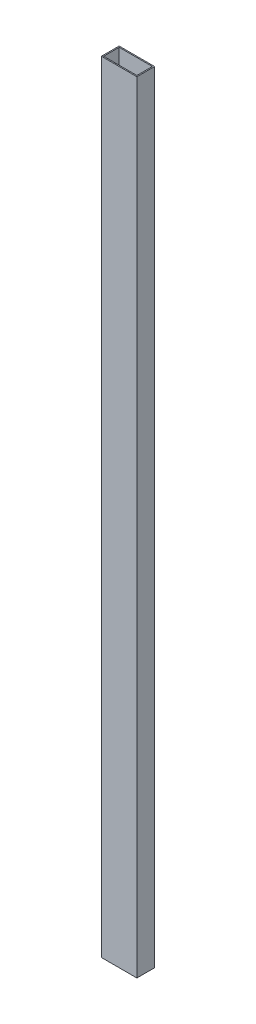
ISO-10303-21;
HEADER;
FILE_DESCRIPTION(('STEP AP214'),'2;1');
FILE_NAME('part.step','',(''),(''),'','','');
FILE_SCHEMA(('AUTOMOTIVE_DESIGN { 1 0 10303 214 1 1 1 1 }'));
ENDSEC;
DATA;
#1=APPLICATION_CONTEXT('core data for automotive mechanical design processes');
#2=APPLICATION_PROTOCOL_DEFINITION('international standard','automotive_design',2000,#1);
#3=PRODUCT_CONTEXT('',#1,'mechanical');
#4=PRODUCT('Part','Part','',(#3));
#5=PRODUCT_RELATED_PRODUCT_CATEGORY('part','',(#4));
#6=PRODUCT_DEFINITION_FORMATION('','',#4);
#7=PRODUCT_DEFINITION_CONTEXT('part definition',#1,'design');
#8=PRODUCT_DEFINITION('design','',#6,#7);
#9=PRODUCT_DEFINITION_SHAPE('','',#8);
#10=(LENGTH_UNIT() NAMED_UNIT(*) SI_UNIT(.MILLI.,.METRE.));
#11=(NAMED_UNIT(*) PLANE_ANGLE_UNIT() SI_UNIT($,.RADIAN.));
#12=(NAMED_UNIT(*) SI_UNIT($,.STERADIAN.) SOLID_ANGLE_UNIT());
#13=UNCERTAINTY_MEASURE_WITH_UNIT(LENGTH_MEASURE(1.E-05),#10,'distance_accuracy_value','');
#14=(GEOMETRIC_REPRESENTATION_CONTEXT(3) GLOBAL_UNCERTAINTY_ASSIGNED_CONTEXT((#13)) GLOBAL_UNIT_ASSIGNED_CONTEXT((#10,
#11,#12)) REPRESENTATION_CONTEXT('',''));
#15=CARTESIAN_POINT('',(0.,0.,0.));
#16=DIRECTION('',(0.,0.,1.));
#17=DIRECTION('',(1.,0.,0.));
#18=AXIS2_PLACEMENT_3D('',#15,#16,#17);
#19=CARTESIAN_POINT('',(0.,1117.6,0.));
#20=DIRECTION('',(0.,-1.,0.));
#21=DIRECTION('',(0.,0.,-1.));
#22=AXIS2_PLACEMENT_3D('',#19,#20,#21);
#23=PLANE('',#22);
#24=DIRECTION('',(0.,0.,1.));
#25=VECTOR('',#24,1.);
#26=CARTESIAN_POINT('',(-1.5875,1117.6,1.5875));
#27=LINE('',#26,#25);
#28=CARTESIAN_POINT('',(-1.5875,1117.6,-23.8125));
#29=VERTEX_POINT('',#28);
#30=CARTESIAN_POINT('',(-1.5875,1117.6,1.5875));
#31=VERTEX_POINT('',#30);
#32=EDGE_CURVE('E134',#29,#31,#27,.T.);
#33=ORIENTED_EDGE('',*,*,#32,.T.);
#34=DIRECTION('',(1.,0.,0.));
#35=VECTOR('',#34,1.);
#36=CARTESIAN_POINT('',(-1.5875,1117.6,1.5875));
#37=LINE('',#36,#35);
#38=CARTESIAN_POINT('',(49.2125,1117.6,1.5875));
#39=VERTEX_POINT('',#38);
#40=EDGE_CURVE('E137',#31,#39,#37,.T.);
#41=ORIENTED_EDGE('',*,*,#40,.T.);
#42=DIRECTION('',(0.,0.,-1.));
#43=VECTOR('',#42,1.);
#44=CARTESIAN_POINT('',(49.2125,1117.6,1.5875));
#45=LINE('',#44,#43);
#46=CARTESIAN_POINT('',(49.2125,1117.6,-23.8125));
#47=VERTEX_POINT('',#46);
#48=EDGE_CURVE('E140',#39,#47,#45,.T.);
#49=ORIENTED_EDGE('',*,*,#48,.T.);
#50=DIRECTION('',(-1.,0.,0.));
#51=VECTOR('',#50,1.);
#52=CARTESIAN_POINT('',(-1.5875,1117.6,-23.8125));
#53=LINE('',#52,#51);
#54=EDGE_CURVE('E142',#47,#29,#53,.T.);
#55=ORIENTED_EDGE('',*,*,#54,.T.);
#56=EDGE_LOOP('',(#33,#41,#49,#55));
#57=FACE_BOUND('',#56,.T.);
#58=DIRECTION('',(0.,0.,1.));
#59=VECTOR('',#58,1.);
#60=CARTESIAN_POINT('',(0.,1117.6,0.));
#61=LINE('',#60,#59);
#62=CARTESIAN_POINT('',(0.,1117.6,-22.225));
#63=VERTEX_POINT('',#62);
#64=CARTESIAN_POINT('',(0.,1117.6,0.));
#65=VERTEX_POINT('',#64);
#66=EDGE_CURVE('E98',#63,#65,#61,.T.);
#67=ORIENTED_EDGE('',*,*,#66,.F.);
#68=DIRECTION('',(-1.,0.,0.));
#69=VECTOR('',#68,1.);
#70=CARTESIAN_POINT('',(0.,1117.6,-22.225));
#71=LINE('',#70,#69);
#72=CARTESIAN_POINT('',(47.625,1117.6,-22.225));
#73=VERTEX_POINT('',#72);
#74=EDGE_CURVE('E120',#73,#63,#71,.T.);
#75=ORIENTED_EDGE('',*,*,#74,.F.);
#76=DIRECTION('',(0.,0.,-1.));
#77=VECTOR('',#76,1.);
#78=CARTESIAN_POINT('',(47.625,1117.6,0.));
#79=LINE('',#78,#77);
#80=CARTESIAN_POINT('',(47.625,1117.6,0.));
#81=VERTEX_POINT('',#80);
#82=EDGE_CURVE('E118',#81,#73,#79,.T.);
#83=ORIENTED_EDGE('',*,*,#82,.F.);
#84=DIRECTION('',(1.,0.,0.));
#85=VECTOR('',#84,1.);
#86=CARTESIAN_POINT('',(0.,1117.6,0.));
#87=LINE('',#86,#85);
#88=EDGE_CURVE('E106',#65,#81,#87,.T.);
#89=ORIENTED_EDGE('',*,*,#88,.F.);
#90=EDGE_LOOP('',(#67,#75,#83,#89));
#91=FACE_BOUND('',#90,.T.);
#92=ADVANCED_FACE('F33',(#57,#91),#23,.F.);
#93=CARTESIAN_POINT('',(0.,0.,0.));
#94=DIRECTION('',(0.,-1.,0.));
#95=DIRECTION('',(0.,0.,-1.));
#96=AXIS2_PLACEMENT_3D('',#93,#94,#95);
#97=PLANE('',#96);
#98=DIRECTION('',(0.,0.,1.));
#99=VECTOR('',#98,1.);
#100=CARTESIAN_POINT('',(-1.5875,0.,1.5875));
#101=LINE('',#100,#99);
#102=CARTESIAN_POINT('',(-1.5875,0.,-23.8125));
#103=VERTEX_POINT('',#102);
#104=CARTESIAN_POINT('',(-1.5875,0.,1.5875));
#105=VERTEX_POINT('',#104);
#106=EDGE_CURVE('E114',#103,#105,#101,.T.);
#107=ORIENTED_EDGE('',*,*,#106,.F.);
#108=DIRECTION('',(-1.,0.,0.));
#109=VECTOR('',#108,1.);
#110=CARTESIAN_POINT('',(-1.5875,0.,-23.8125));
#111=LINE('',#110,#109);
#112=CARTESIAN_POINT('',(49.2125,0.,-23.8125));
#113=VERTEX_POINT('',#112);
#114=EDGE_CURVE('E138',#113,#103,#111,.T.);
#115=ORIENTED_EDGE('',*,*,#114,.F.);
#116=DIRECTION('',(0.,0.,-1.));
#117=VECTOR('',#116,1.);
#118=CARTESIAN_POINT('',(49.2125,0.,1.5875));
#119=LINE('',#118,#117);
#120=CARTESIAN_POINT('',(49.2125,0.,1.5875));
#121=VERTEX_POINT('',#120);
#122=EDGE_CURVE('E149',#121,#113,#119,.T.);
#123=ORIENTED_EDGE('',*,*,#122,.F.);
#124=DIRECTION('',(1.,0.,0.));
#125=VECTOR('',#124,1.);
#126=CARTESIAN_POINT('',(-1.5875,0.,1.5875));
#127=LINE('',#126,#125);
#128=EDGE_CURVE('E147',#105,#121,#127,.T.);
#129=ORIENTED_EDGE('',*,*,#128,.F.);
#130=EDGE_LOOP('',(#107,#115,#123,#129));
#131=FACE_BOUND('',#130,.T.);
#132=DIRECTION('',(-1.,0.,0.));
#133=VECTOR('',#132,1.);
#134=CARTESIAN_POINT('',(0.,0.,-22.225));
#135=LINE('',#134,#133);
#136=CARTESIAN_POINT('',(47.625,0.,-22.225));
#137=VERTEX_POINT('',#136);
#138=CARTESIAN_POINT('',(0.,0.,-22.225));
#139=VERTEX_POINT('',#138);
#140=EDGE_CURVE('E107',#137,#139,#135,.T.);
#141=ORIENTED_EDGE('',*,*,#140,.T.);
#142=DIRECTION('',(0.,0.,1.));
#143=VECTOR('',#142,1.);
#144=CARTESIAN_POINT('',(0.,0.,0.));
#145=LINE('',#144,#143);
#146=CARTESIAN_POINT('',(0.,0.,0.));
#147=VERTEX_POINT('',#146);
#148=EDGE_CURVE('E56',#139,#147,#145,.T.);
#149=ORIENTED_EDGE('',*,*,#148,.T.);
#150=DIRECTION('',(1.,0.,0.));
#151=VECTOR('',#150,1.);
#152=CARTESIAN_POINT('',(0.,0.,0.));
#153=LINE('',#152,#151);
#154=CARTESIAN_POINT('',(47.625,0.,0.));
#155=VERTEX_POINT('',#154);
#156=EDGE_CURVE('E113',#147,#155,#153,.T.);
#157=ORIENTED_EDGE('',*,*,#156,.T.);
#158=DIRECTION('',(0.,0.,-1.));
#159=VECTOR('',#158,1.);
#160=CARTESIAN_POINT('',(47.625,0.,0.));
#161=LINE('',#160,#159);
#162=EDGE_CURVE('E126',#155,#137,#161,.T.);
#163=ORIENTED_EDGE('',*,*,#162,.T.);
#164=EDGE_LOOP('',(#141,#149,#157,#163));
#165=FACE_BOUND('',#164,.T.);
#166=ADVANCED_FACE('F167',(#131,#165),#97,.T.);
#167=CARTESIAN_POINT('',(-1.5875,1117.6,1.5875));
#168=DIRECTION('',(1.,0.,0.));
#169=DIRECTION('',(0.,0.,-1.));
#170=AXIS2_PLACEMENT_3D('',#167,#168,#169);
#171=PLANE('',#170);
#172=ORIENTED_EDGE('',*,*,#106,.T.);
#173=DIRECTION('',(0.,-1.,0.));
#174=VECTOR('',#173,1.);
#175=CARTESIAN_POINT('',(-1.5875,1117.6,1.5875));
#176=LINE('',#175,#174);
#177=EDGE_CURVE('E11',#31,#105,#176,.T.);
#178=ORIENTED_EDGE('',*,*,#177,.F.);
#179=ORIENTED_EDGE('',*,*,#32,.F.);
#180=DIRECTION('',(0.,-1.,0.));
#181=VECTOR('',#180,1.);
#182=CARTESIAN_POINT('',(-1.5875,1117.6,-23.8125));
#183=LINE('',#182,#181);
#184=EDGE_CURVE('E144',#29,#103,#183,.T.);
#185=ORIENTED_EDGE('',*,*,#184,.T.);
#186=EDGE_LOOP('',(#172,#178,#179,#185));
#187=FACE_BOUND('',#186,.T.);
#188=ADVANCED_FACE('F35',(#187),#171,.F.);
#189=CARTESIAN_POINT('',(-1.5875,1117.6,1.5875));
#190=DIRECTION('',(0.,0.,-1.));
#191=DIRECTION('',(-1.,0.,0.));
#192=AXIS2_PLACEMENT_3D('',#189,#190,#191);
#193=PLANE('',#192);
#194=ORIENTED_EDGE('',*,*,#128,.T.);
#195=DIRECTION('',(0.,-1.,0.));
#196=VECTOR('',#195,1.);
#197=CARTESIAN_POINT('',(49.2125,1117.6,1.5875));
#198=LINE('',#197,#196);
#199=EDGE_CURVE('E41',#39,#121,#198,.T.);
#200=ORIENTED_EDGE('',*,*,#199,.F.);
#201=ORIENTED_EDGE('',*,*,#40,.F.);
#202=ORIENTED_EDGE('',*,*,#177,.T.);
#203=EDGE_LOOP('',(#194,#200,#201,#202));
#204=FACE_BOUND('',#203,.T.);
#205=ADVANCED_FACE('F177',(#204),#193,.F.);
#206=CARTESIAN_POINT('',(49.2125,1117.6,1.5875));
#207=DIRECTION('',(-1.,0.,0.));
#208=DIRECTION('',(0.,0.,1.));
#209=AXIS2_PLACEMENT_3D('',#206,#207,#208);
#210=PLANE('',#209);
#211=ORIENTED_EDGE('',*,*,#122,.T.);
#212=DIRECTION('',(0.,-1.,0.));
#213=VECTOR('',#212,1.);
#214=CARTESIAN_POINT('',(49.2125,1117.6,-23.8125));
#215=LINE('',#214,#213);
#216=EDGE_CURVE('E154',#47,#113,#215,.T.);
#217=ORIENTED_EDGE('',*,*,#216,.F.);
#218=ORIENTED_EDGE('',*,*,#48,.F.);
#219=ORIENTED_EDGE('',*,*,#199,.T.);
#220=EDGE_LOOP('',(#211,#217,#218,#219));
#221=FACE_BOUND('',#220,.T.);
#222=ADVANCED_FACE('F161',(#221),#210,.F.);
#223=CARTESIAN_POINT('',(-1.5875,1117.6,-23.8125));
#224=DIRECTION('',(0.,0.,1.));
#225=DIRECTION('',(1.,0.,0.));
#226=AXIS2_PLACEMENT_3D('',#223,#224,#225);
#227=PLANE('',#226);
#228=ORIENTED_EDGE('',*,*,#114,.T.);
#229=ORIENTED_EDGE('',*,*,#184,.F.);
#230=ORIENTED_EDGE('',*,*,#54,.F.);
#231=ORIENTED_EDGE('',*,*,#216,.T.);
#232=EDGE_LOOP('',(#228,#229,#230,#231));
#233=FACE_BOUND('',#232,.T.);
#234=ADVANCED_FACE('F171',(#233),#227,.F.);
#235=CARTESIAN_POINT('',(0.,1117.6,0.));
#236=DIRECTION('',(1.,0.,0.));
#237=DIRECTION('',(0.,0.,-1.));
#238=AXIS2_PLACEMENT_3D('',#235,#236,#237);
#239=PLANE('',#238);
#240=ORIENTED_EDGE('',*,*,#148,.F.);
#241=DIRECTION('',(0.,-1.,0.));
#242=VECTOR('',#241,1.);
#243=CARTESIAN_POINT('',(0.,1117.6,-22.225));
#244=LINE('',#243,#242);
#245=EDGE_CURVE('E102',#63,#139,#244,.T.);
#246=ORIENTED_EDGE('',*,*,#245,.F.);
#247=ORIENTED_EDGE('',*,*,#66,.T.);
#248=DIRECTION('',(0.,-1.,0.));
#249=VECTOR('',#248,1.);
#250=CARTESIAN_POINT('',(0.,1117.6,0.));
#251=LINE('',#250,#249);
#252=EDGE_CURVE('E101',#65,#147,#251,.T.);
#253=ORIENTED_EDGE('',*,*,#252,.T.);
#254=EDGE_LOOP('',(#240,#246,#247,#253));
#255=FACE_BOUND('',#254,.T.);
#256=ADVANCED_FACE('F100',(#255),#239,.T.);
#257=CARTESIAN_POINT('',(0.,1117.6,0.));
#258=DIRECTION('',(0.,0.,-1.));
#259=DIRECTION('',(-1.,0.,0.));
#260=AXIS2_PLACEMENT_3D('',#257,#258,#259);
#261=PLANE('',#260);
#262=ORIENTED_EDGE('',*,*,#156,.F.);
#263=ORIENTED_EDGE('',*,*,#252,.F.);
#264=ORIENTED_EDGE('',*,*,#88,.T.);
#265=DIRECTION('',(0.,-1.,0.));
#266=VECTOR('',#265,1.);
#267=CARTESIAN_POINT('',(47.625,1117.6,0.));
#268=LINE('',#267,#266);
#269=EDGE_CURVE('E115',#81,#155,#268,.T.);
#270=ORIENTED_EDGE('',*,*,#269,.T.);
#271=EDGE_LOOP('',(#262,#263,#264,#270));
#272=FACE_BOUND('',#271,.T.);
#273=ADVANCED_FACE('F110',(#272),#261,.T.);
#274=CARTESIAN_POINT('',(47.625,1117.6,0.));
#275=DIRECTION('',(-1.,0.,0.));
#276=DIRECTION('',(0.,0.,1.));
#277=AXIS2_PLACEMENT_3D('',#274,#275,#276);
#278=PLANE('',#277);
#279=ORIENTED_EDGE('',*,*,#162,.F.);
#280=ORIENTED_EDGE('',*,*,#269,.F.);
#281=ORIENTED_EDGE('',*,*,#82,.T.);
#282=DIRECTION('',(0.,-1.,0.));
#283=VECTOR('',#282,1.);
#284=CARTESIAN_POINT('',(47.625,1117.6,-22.225));
#285=LINE('',#284,#283);
#286=EDGE_CURVE('E48',#73,#137,#285,.T.);
#287=ORIENTED_EDGE('',*,*,#286,.T.);
#288=EDGE_LOOP('',(#279,#280,#281,#287));
#289=FACE_BOUND('',#288,.T.);
#290=ADVANCED_FACE('F200',(#289),#278,.T.);
#291=CARTESIAN_POINT('',(0.,1117.6,-22.225));
#292=DIRECTION('',(0.,0.,1.));
#293=DIRECTION('',(1.,0.,0.));
#294=AXIS2_PLACEMENT_3D('',#291,#292,#293);
#295=PLANE('',#294);
#296=ORIENTED_EDGE('',*,*,#140,.F.);
#297=ORIENTED_EDGE('',*,*,#286,.F.);
#298=ORIENTED_EDGE('',*,*,#74,.T.);
#299=ORIENTED_EDGE('',*,*,#245,.T.);
#300=EDGE_LOOP('',(#296,#297,#298,#299));
#301=FACE_BOUND('',#300,.T.);
#302=ADVANCED_FACE('F204',(#301),#295,.T.);
#303=CLOSED_SHELL('',(#92,#166,#188,#205,#222,#234,#256,#273,#290,#302));
#304=MANIFOLD_SOLID_BREP('B2',#303);
#305=ADVANCED_BREP_SHAPE_REPRESENTATION('',(#18,#304),#14);
#306=SHAPE_DEFINITION_REPRESENTATION(#9,#305);
ENDSEC;
END-ISO-10303-21;
